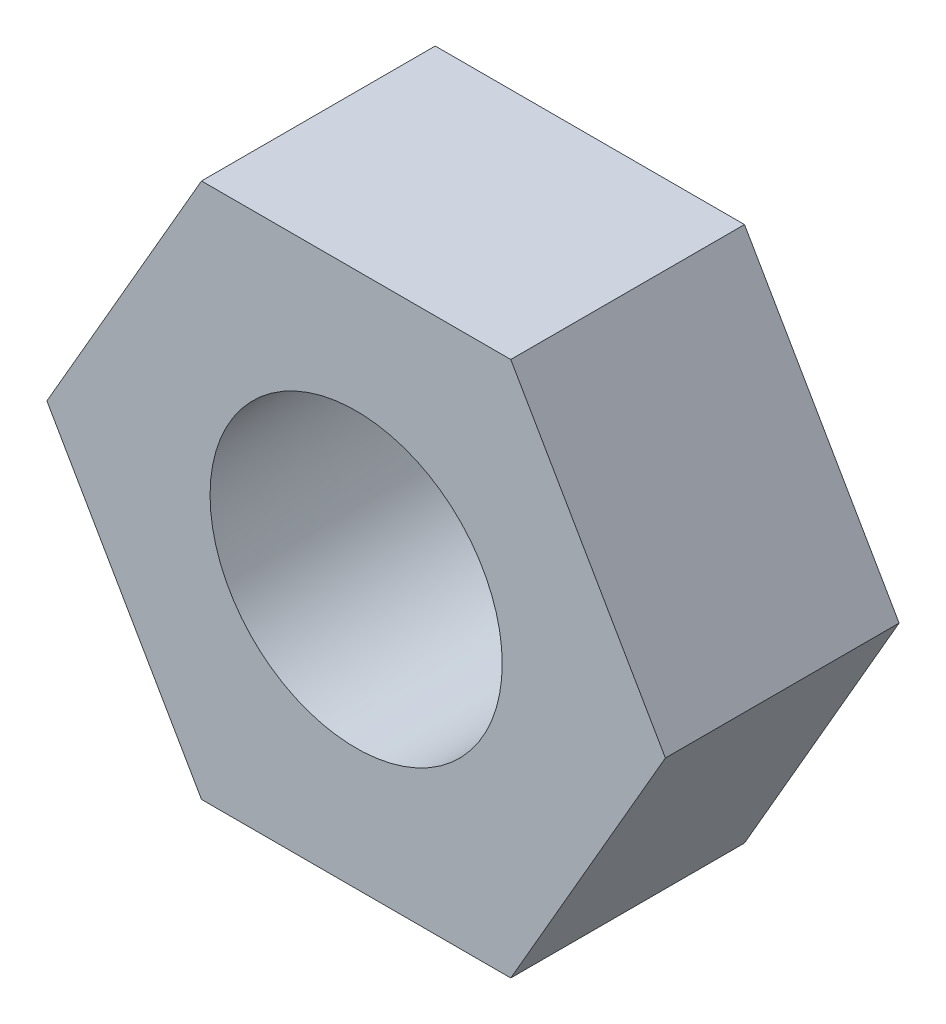
ISO-10303-21;
HEADER;
FILE_DESCRIPTION(('STEP AP214'),'2;1');
FILE_NAME('part.step','',(''),(''),'','','');
FILE_SCHEMA(('AUTOMOTIVE_DESIGN { 1 0 10303 214 1 1 1 1 }'));
ENDSEC;
DATA;
#1=APPLICATION_CONTEXT('core data for automotive mechanical design processes');
#2=APPLICATION_PROTOCOL_DEFINITION('international standard','automotive_design',2000,#1);
#3=PRODUCT_CONTEXT('',#1,'mechanical');
#4=PRODUCT('Part','Part','',(#3));
#5=PRODUCT_RELATED_PRODUCT_CATEGORY('part','',(#4));
#6=PRODUCT_DEFINITION_FORMATION('','',#4);
#7=PRODUCT_DEFINITION_CONTEXT('part definition',#1,'design');
#8=PRODUCT_DEFINITION('design','',#6,#7);
#9=PRODUCT_DEFINITION_SHAPE('','',#8);
#10=(LENGTH_UNIT() NAMED_UNIT(*) SI_UNIT(.MILLI.,.METRE.));
#11=(NAMED_UNIT(*) PLANE_ANGLE_UNIT() SI_UNIT($,.RADIAN.));
#12=(NAMED_UNIT(*) SI_UNIT($,.STERADIAN.) SOLID_ANGLE_UNIT());
#13=UNCERTAINTY_MEASURE_WITH_UNIT(LENGTH_MEASURE(1.E-05),#10,'distance_accuracy_value','');
#14=(GEOMETRIC_REPRESENTATION_CONTEXT(3) GLOBAL_UNCERTAINTY_ASSIGNED_CONTEXT((#13)) GLOBAL_UNIT_ASSIGNED_CONTEXT((#10,
#11,#12)) REPRESENTATION_CONTEXT('',''));
#15=CARTESIAN_POINT('',(0.,0.,0.));
#16=DIRECTION('',(0.,0.,1.));
#17=DIRECTION('',(1.,0.,0.));
#18=AXIS2_PLACEMENT_3D('',#15,#16,#17);
#19=CARTESIAN_POINT('',(-1.58771324027147,-2.75,2.4));
#20=DIRECTION('',(0.,1.,0.));
#21=DIRECTION('',(-1.,0.,0.));
#22=AXIS2_PLACEMENT_3D('',#19,#20,#21);
#23=PLANE('',#22);
#24=DIRECTION('',(1.,0.,0.));
#25=VECTOR('',#24,1.);
#26=CARTESIAN_POINT('',(-1.58771324027147,-2.75,0.));
#27=LINE('',#26,#25);
#28=CARTESIAN_POINT('',(-1.58771324027147,-2.75,0.));
#29=VERTEX_POINT('',#28);
#30=CARTESIAN_POINT('',(1.58771324027147,-2.75,0.));
#31=VERTEX_POINT('',#30);
#32=EDGE_CURVE('E128',#29,#31,#27,.T.);
#33=ORIENTED_EDGE('',*,*,#32,.T.);
#34=DIRECTION('',(0.,0.,-1.));
#35=VECTOR('',#34,1.);
#36=CARTESIAN_POINT('',(1.58771324027147,-2.75,2.4));
#37=LINE('',#36,#35);
#38=CARTESIAN_POINT('',(1.58771324027147,-2.75,2.4));
#39=VERTEX_POINT('',#38);
#40=EDGE_CURVE('E11',#39,#31,#37,.T.);
#41=ORIENTED_EDGE('',*,*,#40,.F.);
#42=DIRECTION('',(1.,0.,0.));
#43=VECTOR('',#42,1.);
#44=CARTESIAN_POINT('',(-1.58771324027147,-2.75,2.4));
#45=LINE('',#44,#43);
#46=CARTESIAN_POINT('',(-1.58771324027147,-2.75,2.4));
#47=VERTEX_POINT('',#46);
#48=EDGE_CURVE('E145',#47,#39,#45,.T.);
#49=ORIENTED_EDGE('',*,*,#48,.F.);
#50=DIRECTION('',(0.,0.,-1.));
#51=VECTOR('',#50,1.);
#52=CARTESIAN_POINT('',(-1.58771324027147,-2.75,2.4));
#53=LINE('',#52,#51);
#54=EDGE_CURVE('E124',#47,#29,#53,.T.);
#55=ORIENTED_EDGE('',*,*,#54,.T.);
#56=EDGE_LOOP('',(#33,#41,#49,#55));
#57=FACE_BOUND('',#56,.T.);
#58=ADVANCED_FACE('F39',(#57),#23,.F.);
#59=CARTESIAN_POINT('',(1.58771324027147,-2.75,2.4));
#60=DIRECTION('',(-0.866025403784439,0.5,0.));
#61=DIRECTION('',(-0.5,-0.866025403784439,0.));
#62=AXIS2_PLACEMENT_3D('',#59,#60,#61);
#63=PLANE('',#62);
#64=DIRECTION('',(0.5,0.866025403784439,0.));
#65=VECTOR('',#64,1.);
#66=CARTESIAN_POINT('',(1.58771324027147,-2.75,0.));
#67=LINE('',#66,#65);
#68=CARTESIAN_POINT('',(3.17542648054294,0.,0.));
#69=VERTEX_POINT('',#68);
#70=EDGE_CURVE('E132',#31,#69,#67,.T.);
#71=ORIENTED_EDGE('',*,*,#70,.T.);
#72=DIRECTION('',(0.,0.,-1.));
#73=VECTOR('',#72,1.);
#74=CARTESIAN_POINT('',(3.17542648054294,0.,2.4));
#75=LINE('',#74,#73);
#76=CARTESIAN_POINT('',(3.17542648054294,0.,2.4));
#77=VERTEX_POINT('',#76);
#78=EDGE_CURVE('E48',#77,#69,#75,.T.);
#79=ORIENTED_EDGE('',*,*,#78,.F.);
#80=DIRECTION('',(0.5,0.866025403784439,0.));
#81=VECTOR('',#80,1.);
#82=CARTESIAN_POINT('',(1.58771324027147,-2.75,2.4));
#83=LINE('',#82,#81);
#84=EDGE_CURVE('E93',#39,#77,#83,.T.);
#85=ORIENTED_EDGE('',*,*,#84,.F.);
#86=ORIENTED_EDGE('',*,*,#40,.T.);
#87=EDGE_LOOP('',(#71,#79,#85,#86));
#88=FACE_BOUND('',#87,.T.);
#89=ADVANCED_FACE('F174',(#88),#63,.F.);
#90=CARTESIAN_POINT('',(3.17542648054294,0.,2.4));
#91=DIRECTION('',(-0.866025403784439,-0.5,0.));
#92=DIRECTION('',(0.5,-0.866025403784439,0.));
#93=AXIS2_PLACEMENT_3D('',#90,#91,#92);
#94=PLANE('',#93);
#95=DIRECTION('',(-0.5,0.866025403784438,0.));
#96=VECTOR('',#95,1.);
#97=CARTESIAN_POINT('',(3.17542648054294,0.,0.));
#98=LINE('',#97,#96);
#99=CARTESIAN_POINT('',(1.58771324027147,2.75,0.));
#100=VERTEX_POINT('',#99);
#101=EDGE_CURVE('E136',#69,#100,#98,.T.);
#102=ORIENTED_EDGE('',*,*,#101,.T.);
#103=DIRECTION('',(0.,0.,-1.));
#104=VECTOR('',#103,1.);
#105=CARTESIAN_POINT('',(1.58771324027147,2.75,2.4));
#106=LINE('',#105,#104);
#107=CARTESIAN_POINT('',(1.58771324027147,2.75,2.4));
#108=VERTEX_POINT('',#107);
#109=EDGE_CURVE('E117',#108,#100,#106,.T.);
#110=ORIENTED_EDGE('',*,*,#109,.F.);
#111=DIRECTION('',(-0.5,0.866025403784438,0.));
#112=VECTOR('',#111,1.);
#113=CARTESIAN_POINT('',(3.17542648054294,0.,2.4));
#114=LINE('',#113,#112);
#115=EDGE_CURVE('E106',#77,#108,#114,.T.);
#116=ORIENTED_EDGE('',*,*,#115,.F.);
#117=ORIENTED_EDGE('',*,*,#78,.T.);
#118=EDGE_LOOP('',(#102,#110,#116,#117));
#119=FACE_BOUND('',#118,.T.);
#120=ADVANCED_FACE('F155',(#119),#94,.F.);
#121=CARTESIAN_POINT('',(1.58771324027147,2.75,2.4));
#122=DIRECTION('',(0.,-1.,0.));
#123=DIRECTION('',(0.,0.,-1.));
#124=AXIS2_PLACEMENT_3D('',#121,#122,#123);
#125=PLANE('',#124);
#126=DIRECTION('',(-1.,0.,0.));
#127=VECTOR('',#126,1.);
#128=CARTESIAN_POINT('',(1.58771324027147,2.75,0.));
#129=LINE('',#128,#127);
#130=CARTESIAN_POINT('',(-1.58771324027147,2.75,0.));
#131=VERTEX_POINT('',#130);
#132=EDGE_CURVE('E115',#100,#131,#129,.T.);
#133=ORIENTED_EDGE('',*,*,#132,.T.);
#134=DIRECTION('',(0.,0.,-1.));
#135=VECTOR('',#134,1.);
#136=CARTESIAN_POINT('',(-1.58771324027147,2.75,2.4));
#137=LINE('',#136,#135);
#138=CARTESIAN_POINT('',(-1.58771324027147,2.75,2.4));
#139=VERTEX_POINT('',#138);
#140=EDGE_CURVE('E112',#139,#131,#137,.T.);
#141=ORIENTED_EDGE('',*,*,#140,.F.);
#142=DIRECTION('',(-1.,0.,0.));
#143=VECTOR('',#142,1.);
#144=CARTESIAN_POINT('',(1.58771324027147,2.75,2.4));
#145=LINE('',#144,#143);
#146=EDGE_CURVE('E100',#108,#139,#145,.T.);
#147=ORIENTED_EDGE('',*,*,#146,.F.);
#148=ORIENTED_EDGE('',*,*,#109,.T.);
#149=EDGE_LOOP('',(#133,#141,#147,#148));
#150=FACE_BOUND('',#149,.T.);
#151=ADVANCED_FACE('F113',(#150),#125,.F.);
#152=CARTESIAN_POINT('',(-1.58771324027147,2.75,2.4));
#153=DIRECTION('',(0.866025403784439,-0.5,0.));
#154=DIRECTION('',(0.5,0.866025403784439,0.));
#155=AXIS2_PLACEMENT_3D('',#152,#153,#154);
#156=PLANE('',#155);
#157=DIRECTION('',(-0.5,-0.866025403784439,0.));
#158=VECTOR('',#157,1.);
#159=CARTESIAN_POINT('',(-1.58771324027147,2.75,0.));
#160=LINE('',#159,#158);
#161=CARTESIAN_POINT('',(-3.17542648054294,0.,0.));
#162=VERTEX_POINT('',#161);
#163=EDGE_CURVE('E79',#131,#162,#160,.T.);
#164=ORIENTED_EDGE('',*,*,#163,.T.);
#165=DIRECTION('',(0.,0.,-1.));
#166=VECTOR('',#165,1.);
#167=CARTESIAN_POINT('',(-3.17542648054294,0.,2.4));
#168=LINE('',#167,#166);
#169=CARTESIAN_POINT('',(-3.17542648054294,0.,2.4));
#170=VERTEX_POINT('',#169);
#171=EDGE_CURVE('E118',#170,#162,#168,.T.);
#172=ORIENTED_EDGE('',*,*,#171,.F.);
#173=DIRECTION('',(-0.5,-0.866025403784439,0.));
#174=VECTOR('',#173,1.);
#175=CARTESIAN_POINT('',(-1.58771324027147,2.75,2.4));
#176=LINE('',#175,#174);
#177=EDGE_CURVE('E104',#139,#170,#176,.T.);
#178=ORIENTED_EDGE('',*,*,#177,.F.);
#179=ORIENTED_EDGE('',*,*,#140,.T.);
#180=EDGE_LOOP('',(#164,#172,#178,#179));
#181=FACE_BOUND('',#180,.T.);
#182=ADVANCED_FACE('F120',(#181),#156,.F.);
#183=CARTESIAN_POINT('',(-3.17542648054294,0.,2.4));
#184=DIRECTION('',(0.866025403784438,0.5,0.));
#185=DIRECTION('',(-0.5,0.866025403784439,0.));
#186=AXIS2_PLACEMENT_3D('',#183,#184,#185);
#187=PLANE('',#186);
#188=DIRECTION('',(0.5,-0.866025403784438,0.));
#189=VECTOR('',#188,1.);
#190=CARTESIAN_POINT('',(-3.17542648054294,0.,0.));
#191=LINE('',#190,#189);
#192=EDGE_CURVE('E85',#162,#29,#191,.T.);
#193=ORIENTED_EDGE('',*,*,#192,.T.);
#194=ORIENTED_EDGE('',*,*,#54,.F.);
#195=DIRECTION('',(0.5,-0.866025403784438,0.));
#196=VECTOR('',#195,1.);
#197=CARTESIAN_POINT('',(-3.17542648054294,0.,2.4));
#198=LINE('',#197,#196);
#199=EDGE_CURVE('E56',#170,#47,#198,.T.);
#200=ORIENTED_EDGE('',*,*,#199,.F.);
#201=ORIENTED_EDGE('',*,*,#171,.T.);
#202=EDGE_LOOP('',(#193,#194,#200,#201));
#203=FACE_BOUND('',#202,.T.);
#204=ADVANCED_FACE('F162',(#203),#187,.F.);
#205=CARTESIAN_POINT('',(0.,0.,2.4));
#206=DIRECTION('',(0.,0.,1.));
#207=DIRECTION('',(1.,0.,0.));
#208=AXIS2_PLACEMENT_3D('',#205,#206,#207);
#209=PLANE('',#208);
#210=CARTESIAN_POINT('',(0.,0.,2.4));
#211=DIRECTION('',(0.,0.,1.));
#212=DIRECTION('',(1.,0.,0.));
#213=AXIS2_PLACEMENT_3D('',#210,#211,#212);
#214=CIRCLE('',#213,1.5);
#215=CARTESIAN_POINT('',(1.5,0.,2.4));
#216=VERTEX_POINT('',#215);
#217=EDGE_CURVE('E227',#216,#216,#214,.T.);
#218=ORIENTED_EDGE('',*,*,#217,.F.);
#219=EDGE_LOOP('',(#218));
#220=FACE_BOUND('',#219,.T.);
#221=ORIENTED_EDGE('',*,*,#48,.T.);
#222=ORIENTED_EDGE('',*,*,#84,.T.);
#223=ORIENTED_EDGE('',*,*,#115,.T.);
#224=ORIENTED_EDGE('',*,*,#146,.T.);
#225=ORIENTED_EDGE('',*,*,#177,.T.);
#226=ORIENTED_EDGE('',*,*,#199,.T.);
#227=EDGE_LOOP('',(#221,#222,#223,#224,#225,#226));
#228=FACE_BOUND('',#227,.T.);
#229=ADVANCED_FACE('F102',(#220,#228),#209,.T.);
#230=CARTESIAN_POINT('',(0.,0.,0.));
#231=DIRECTION('',(0.,0.,1.));
#232=DIRECTION('',(1.,0.,0.));
#233=AXIS2_PLACEMENT_3D('',#230,#231,#232);
#234=PLANE('',#233);
#235=CARTESIAN_POINT('',(0.,0.,0.));
#236=DIRECTION('',(0.,0.,1.));
#237=DIRECTION('',(1.,0.,0.));
#238=AXIS2_PLACEMENT_3D('',#235,#236,#237);
#239=CIRCLE('',#238,1.5);
#240=CARTESIAN_POINT('',(1.5,0.,0.));
#241=VERTEX_POINT('',#240);
#242=EDGE_CURVE('E133',#241,#241,#239,.F.);
#243=ORIENTED_EDGE('',*,*,#242,.F.);
#244=EDGE_LOOP('',(#243));
#245=FACE_BOUND('',#244,.T.);
#246=ORIENTED_EDGE('',*,*,#32,.F.);
#247=ORIENTED_EDGE('',*,*,#192,.F.);
#248=ORIENTED_EDGE('',*,*,#163,.F.);
#249=ORIENTED_EDGE('',*,*,#132,.F.);
#250=ORIENTED_EDGE('',*,*,#101,.F.);
#251=ORIENTED_EDGE('',*,*,#70,.F.);
#252=EDGE_LOOP('',(#246,#247,#248,#249,#250,#251));
#253=FACE_BOUND('',#252,.T.);
#254=ADVANCED_FACE('F158',(#245,#253),#234,.F.);
#255=CARTESIAN_POINT('',(0.,0.,-0.00100000000000013));
#256=DIRECTION('',(0.,0.,1.));
#257=DIRECTION('',(1.,0.,0.));
#258=AXIS2_PLACEMENT_3D('',#255,#256,#257);
#259=CYLINDRICAL_SURFACE('',#258,1.5);
#260=ORIENTED_EDGE('',*,*,#217,.T.);
#261=EDGE_LOOP('',(#260));
#262=FACE_BOUND('',#261,.T.);
#263=ORIENTED_EDGE('',*,*,#242,.T.);
#264=EDGE_LOOP('',(#263));
#265=FACE_BOUND('',#264,.T.);
#266=ADVANCED_FACE('F211',(#262,#265),#259,.F.);
#267=CLOSED_SHELL('',(#58,#89,#120,#151,#182,#204,#229,#254,#266));
#268=MANIFOLD_SOLID_BREP('B2',#267);
#269=ADVANCED_BREP_SHAPE_REPRESENTATION('',(#18,#268),#14);
#270=SHAPE_DEFINITION_REPRESENTATION(#9,#269);
ENDSEC;
END-ISO-10303-21;
